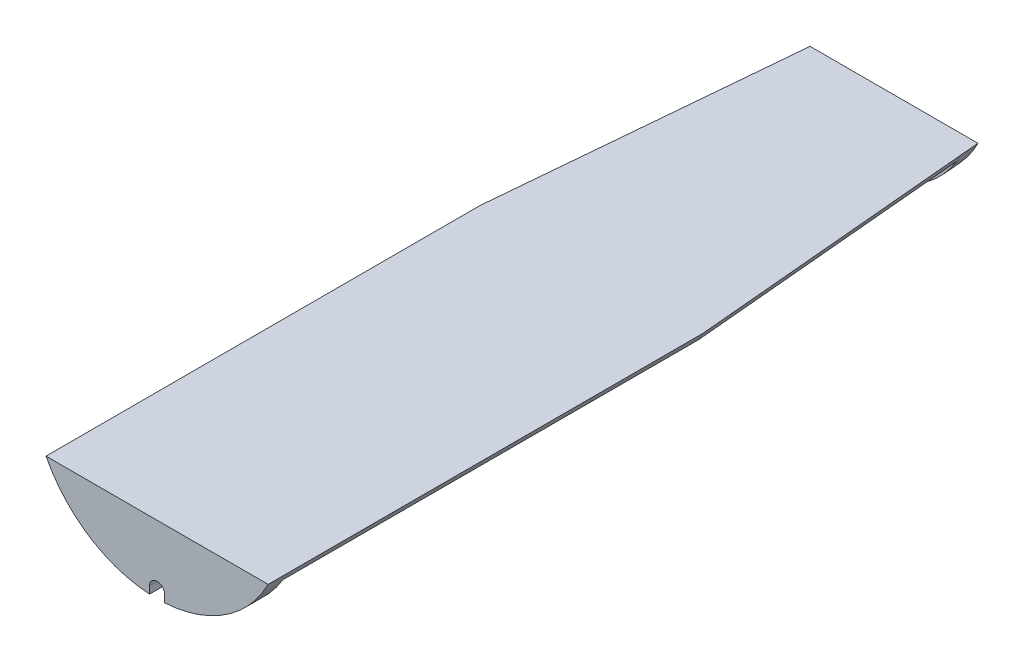
ISO-10303-21;
HEADER;
FILE_DESCRIPTION(('STEP AP214'),'2;1');
FILE_NAME('part.step','',(''),(''),'','','');
FILE_SCHEMA(('AUTOMOTIVE_DESIGN { 1 0 10303 214 1 1 1 1 }'));
ENDSEC;
DATA;
#1=APPLICATION_CONTEXT('core data for automotive mechanical design processes');
#2=APPLICATION_PROTOCOL_DEFINITION('international standard','automotive_design',2000,#1);
#3=PRODUCT_CONTEXT('',#1,'mechanical');
#4=PRODUCT('Part','Part','',(#3));
#5=PRODUCT_RELATED_PRODUCT_CATEGORY('part','',(#4));
#6=PRODUCT_DEFINITION_FORMATION('','',#4);
#7=PRODUCT_DEFINITION_CONTEXT('part definition',#1,'design');
#8=PRODUCT_DEFINITION('design','',#6,#7);
#9=PRODUCT_DEFINITION_SHAPE('','',#8);
#10=(LENGTH_UNIT() NAMED_UNIT(*) SI_UNIT(.MILLI.,.METRE.));
#11=(NAMED_UNIT(*) PLANE_ANGLE_UNIT() SI_UNIT($,.RADIAN.));
#12=(NAMED_UNIT(*) SI_UNIT($,.STERADIAN.) SOLID_ANGLE_UNIT());
#13=UNCERTAINTY_MEASURE_WITH_UNIT(LENGTH_MEASURE(1.E-05),#10,'distance_accuracy_value','');
#14=(GEOMETRIC_REPRESENTATION_CONTEXT(3) GLOBAL_UNCERTAINTY_ASSIGNED_CONTEXT((#13)) GLOBAL_UNIT_ASSIGNED_CONTEXT((#10,
#11,#12)) REPRESENTATION_CONTEXT('',''));
#15=CARTESIAN_POINT('',(0.,0.,0.));
#16=DIRECTION('',(0.,0.,1.));
#17=DIRECTION('',(1.,0.,0.));
#18=AXIS2_PLACEMENT_3D('',#15,#16,#17);
#19=CARTESIAN_POINT('',(0.,15.,-5.));
#20=DIRECTION('',(0.,0.,1.));
#21=DIRECTION('',(1.,0.,0.));
#22=AXIS2_PLACEMENT_3D('',#19,#20,#21);
#23=PLANE('',#22);
#24=DIRECTION('',(-1.,0.,0.));
#25=VECTOR('',#24,1.);
#26=CARTESIAN_POINT('',(28.2842712474619,-2.00000000000001,-5.));
#27=LINE('',#26,#25);
#28=CARTESIAN_POINT('',(28.2842712474619,-2.00000000000001,-5.));
#29=VERTEX_POINT('',#28);
#30=CARTESIAN_POINT('',(-28.2842712474619,-2.00000000000001,-5.));
#31=VERTEX_POINT('',#30);
#32=EDGE_CURVE('E178',#29,#31,#27,.T.);
#33=ORIENTED_EDGE('',*,*,#32,.F.);
#34=CARTESIAN_POINT('',(0.,15.,-5.));
#35=DIRECTION('',(0.,0.,1.));
#36=DIRECTION('',(1.,0.,0.));
#37=AXIS2_PLACEMENT_3D('',#34,#35,#36);
#38=CIRCLE('',#37,33.);
#39=CARTESIAN_POINT('',(2.00000000000002,-17.9393381840012,-5.));
#40=VERTEX_POINT('',#39);
#41=EDGE_CURVE('E259',#40,#29,#38,.T.);
#42=ORIENTED_EDGE('',*,*,#41,.F.);
#43=DIRECTION('',(0.,-1.,0.));
#44=VECTOR('',#43,1.);
#45=CARTESIAN_POINT('',(2.00000000000002,-16.,-5.));
#46=LINE('',#45,#44);
#47=CARTESIAN_POINT('',(2.00000000000002,-16.,-5.));
#48=VERTEX_POINT('',#47);
#49=EDGE_CURVE('E247',#48,#40,#46,.T.);
#50=ORIENTED_EDGE('',*,*,#49,.F.);
#51=CARTESIAN_POINT('',(0.,-16.,-5.));
#52=DIRECTION('',(0.,0.,-1.));
#53=DIRECTION('',(1.,0.,0.));
#54=AXIS2_PLACEMENT_3D('',#51,#52,#53);
#55=CIRCLE('',#54,2.);
#56=CARTESIAN_POINT('',(-1.99999999999998,-16.,-5.));
#57=VERTEX_POINT('',#56);
#58=EDGE_CURVE('E253',#57,#48,#55,.T.);
#59=ORIENTED_EDGE('',*,*,#58,.F.);
#60=DIRECTION('',(0.,1.,0.));
#61=VECTOR('',#60,1.);
#62=CARTESIAN_POINT('',(-1.99999999999998,-17.9393381840012,-5.));
#63=LINE('',#62,#61);
#64=CARTESIAN_POINT('',(-1.99999999999998,-17.9393381840012,-5.));
#65=VERTEX_POINT('',#64);
#66=EDGE_CURVE('E257',#65,#57,#63,.T.);
#67=ORIENTED_EDGE('',*,*,#66,.F.);
#68=CARTESIAN_POINT('',(0.,15.,-5.));
#69=DIRECTION('',(0.,0.,1.));
#70=DIRECTION('',(1.,0.,0.));
#71=AXIS2_PLACEMENT_3D('',#68,#69,#70);
#72=CIRCLE('',#71,33.);
#73=EDGE_CURVE('E239',#31,#65,#72,.T.);
#74=ORIENTED_EDGE('',*,*,#73,.F.);
#75=EDGE_LOOP('',(#33,#42,#50,#59,#67,#74));
#76=FACE_BOUND('',#75,.T.);
#77=ADVANCED_FACE('F157',(#76),#23,.F.);
#78=CARTESIAN_POINT('',(0.,15.,-5.));
#79=DIRECTION('',(0.,0.,1.));
#80=DIRECTION('',(1.,0.,0.));
#81=AXIS2_PLACEMENT_3D('',#78,#79,#80);
#82=CYLINDRICAL_SURFACE('',#81,33.);
#83=CARTESIAN_POINT('',(0.,15.,0.));
#84=DIRECTION('',(0.,0.,1.));
#85=DIRECTION('',(1.,0.,0.));
#86=AXIS2_PLACEMENT_3D('',#83,#84,#85);
#87=CIRCLE('',#86,33.);
#88=CARTESIAN_POINT('',(2.00000000000002,-17.9393381840012,0.));
#89=VERTEX_POINT('',#88);
#90=CARTESIAN_POINT('',(29.3938769133981,0.,0.));
#91=VERTEX_POINT('',#90);
#92=EDGE_CURVE('E264',#89,#91,#87,.T.);
#93=ORIENTED_EDGE('',*,*,#92,.F.);
#94=DIRECTION('',(0.,0.,1.));
#95=VECTOR('',#94,1.);
#96=CARTESIAN_POINT('',(2.00000000000002,-17.9393381840012,-5.));
#97=LINE('',#96,#95);
#98=EDGE_CURVE('E12',#40,#89,#97,.T.);
#99=ORIENTED_EDGE('',*,*,#98,.F.);
#100=ORIENTED_EDGE('',*,*,#41,.T.);
#101=DIRECTION('',(0.,0.,1.));
#102=VECTOR('',#101,1.);
#103=CARTESIAN_POINT('',(28.2842712474619,-2.00000000000001,-115.));
#104=LINE('',#103,#102);
#105=CARTESIAN_POINT('',(28.2842712474619,-2.,-115.));
#106=VERTEX_POINT('',#105);
#107=EDGE_CURVE('E268',#106,#29,#104,.T.);
#108=ORIENTED_EDGE('',*,*,#107,.F.);
#109=CARTESIAN_POINT('',(29.3938769133981,0.,-115.));
#110=CARTESIAN_POINT('',(29.3071144612497,-0.170019355881885,-114.999994009761));
#111=CARTESIAN_POINT('',(29.2188765786215,-0.339285789890905,-114.999975122605));
#112=CARTESIAN_POINT('',(29.0394771916427,-0.676262181711073,-114.999940279216));
#113=CARTESIAN_POINT('',(28.9483156872977,-0.843972139525185,-114.999924322983));
#114=CARTESIAN_POINT('',(28.7633315166437,-1.1773610188988,-114.999924066524));
#115=CARTESIAN_POINT('',(28.6695161975613,-1.34304401719383,-114.999939685997));
#116=CARTESIAN_POINT('',(28.4790286187982,-1.67276773070671,-114.999974321316));
#117=CARTESIAN_POINT('',(28.3823562523676,-1.83680838425315,-114.99999333729));
#118=CARTESIAN_POINT('',(28.2842712474619,-1.99999999999998,-115.));
#119=B_SPLINE_CURVE_WITH_KNOTS('',3,(#109,#110,#111,#112,#113,#114,#115,#116,#117,#118),
.UNSPECIFIED.,.F.,.F.,(4,2,2,2,4),(0.,0.572625992789031,1.14525198448761,1.71642355424388,
2.28761649212509),.UNSPECIFIED.);
#120=CARTESIAN_POINT('',(29.3938769133982,0.,-114.999999999998));
#121=VERTEX_POINT('',#120);
#122=EDGE_CURVE('E288',#121,#106,#119,.T.);
#123=ORIENTED_EDGE('',*,*,#122,.F.);
#124=DIRECTION('',(0.,0.,1.));
#125=VECTOR('',#124,1.);
#126=CARTESIAN_POINT('',(29.3938769133981,0.,-5.));
#127=LINE('',#126,#125);
#128=EDGE_CURVE('E215',#121,#91,#127,.T.);
#129=ORIENTED_EDGE('',*,*,#128,.T.);
#130=EDGE_LOOP('',(#93,#99,#100,#108,#123,#129));
#131=FACE_BOUND('',#130,.T.);
#132=ADVANCED_FACE('F159',(#131),#82,.T.);
#133=CARTESIAN_POINT('',(2.00000000000002,-16.,-5.));
#134=DIRECTION('',(-1.,0.,0.));
#135=DIRECTION('',(0.,0.,1.));
#136=AXIS2_PLACEMENT_3D('',#133,#134,#135);
#137=PLANE('',#136);
#138=DIRECTION('',(0.,-1.,0.));
#139=VECTOR('',#138,1.);
#140=CARTESIAN_POINT('',(2.00000000000002,-16.,0.));
#141=LINE('',#140,#139);
#142=CARTESIAN_POINT('',(2.00000000000002,-16.,0.));
#143=VERTEX_POINT('',#142);
#144=EDGE_CURVE('E249',#143,#89,#141,.T.);
#145=ORIENTED_EDGE('',*,*,#144,.F.);
#146=DIRECTION('',(0.,0.,1.));
#147=VECTOR('',#146,1.);
#148=CARTESIAN_POINT('',(2.00000000000002,-16.,-5.));
#149=LINE('',#148,#147);
#150=EDGE_CURVE('E169',#48,#143,#149,.T.);
#151=ORIENTED_EDGE('',*,*,#150,.F.);
#152=ORIENTED_EDGE('',*,*,#49,.T.);
#153=ORIENTED_EDGE('',*,*,#98,.T.);
#154=EDGE_LOOP('',(#145,#151,#152,#153));
#155=FACE_BOUND('',#154,.T.);
#156=ADVANCED_FACE('F245',(#155),#137,.T.);
#157=CARTESIAN_POINT('',(0.,-16.,-5.));
#158=DIRECTION('',(0.,0.,1.));
#159=DIRECTION('',(1.,0.,0.));
#160=AXIS2_PLACEMENT_3D('',#157,#158,#159);
#161=CYLINDRICAL_SURFACE('',#160,2.);
#162=CARTESIAN_POINT('',(0.,-16.,0.));
#163=DIRECTION('',(0.,0.,-1.));
#164=DIRECTION('',(1.,0.,0.));
#165=AXIS2_PLACEMENT_3D('',#162,#163,#164);
#166=CIRCLE('',#165,2.);
#167=CARTESIAN_POINT('',(-1.99999999999998,-16.,0.));
#168=VERTEX_POINT('',#167);
#169=EDGE_CURVE('E277',#168,#143,#166,.T.);
#170=ORIENTED_EDGE('',*,*,#169,.F.);
#171=DIRECTION('',(0.,0.,1.));
#172=VECTOR('',#171,1.);
#173=CARTESIAN_POINT('',(-1.99999999999998,-16.,-5.));
#174=LINE('',#173,#172);
#175=EDGE_CURVE('E250',#57,#168,#174,.T.);
#176=ORIENTED_EDGE('',*,*,#175,.F.);
#177=ORIENTED_EDGE('',*,*,#58,.T.);
#178=ORIENTED_EDGE('',*,*,#150,.T.);
#179=EDGE_LOOP('',(#170,#176,#177,#178));
#180=FACE_BOUND('',#179,.T.);
#181=ADVANCED_FACE('F254',(#180),#161,.F.);
#182=CARTESIAN_POINT('',(-1.99999999999998,-17.9393381840012,-5.));
#183=DIRECTION('',(1.,0.,0.));
#184=DIRECTION('',(0.,0.,-1.));
#185=AXIS2_PLACEMENT_3D('',#182,#183,#184);
#186=PLANE('',#185);
#187=DIRECTION('',(0.,1.,0.));
#188=VECTOR('',#187,1.);
#189=CARTESIAN_POINT('',(-1.99999999999998,-17.9393381840012,0.));
#190=LINE('',#189,#188);
#191=CARTESIAN_POINT('',(-1.99999999999998,-17.9393381840012,0.));
#192=VERTEX_POINT('',#191);
#193=EDGE_CURVE('E274',#192,#168,#190,.T.);
#194=ORIENTED_EDGE('',*,*,#193,.F.);
#195=DIRECTION('',(0.,0.,1.));
#196=VECTOR('',#195,1.);
#197=CARTESIAN_POINT('',(-1.99999999999998,-17.9393381840012,-5.));
#198=LINE('',#197,#196);
#199=EDGE_CURVE('E281',#65,#192,#198,.T.);
#200=ORIENTED_EDGE('',*,*,#199,.F.);
#201=ORIENTED_EDGE('',*,*,#66,.T.);
#202=ORIENTED_EDGE('',*,*,#175,.T.);
#203=EDGE_LOOP('',(#194,#200,#201,#202));
#204=FACE_BOUND('',#203,.T.);
#205=ADVANCED_FACE('F656',(#204),#186,.T.);
#206=CARTESIAN_POINT('',(0.,15.,-5.));
#207=DIRECTION('',(0.,0.,1.));
#208=DIRECTION('',(1.,0.,0.));
#209=AXIS2_PLACEMENT_3D('',#206,#207,#208);
#210=CYLINDRICAL_SURFACE('',#209,33.);
#211=CARTESIAN_POINT('',(0.,15.,0.));
#212=DIRECTION('',(0.,0.,1.));
#213=DIRECTION('',(1.,0.,0.));
#214=AXIS2_PLACEMENT_3D('',#211,#212,#213);
#215=CIRCLE('',#214,33.);
#216=CARTESIAN_POINT('',(-29.3938769133981,0.,0.));
#217=VERTEX_POINT('',#216);
#218=EDGE_CURVE('E271',#217,#192,#215,.T.);
#219=ORIENTED_EDGE('',*,*,#218,.F.);
#220=DIRECTION('',(0.,0.,1.));
#221=VECTOR('',#220,1.);
#222=CARTESIAN_POINT('',(-29.3938769133981,0.,-5.));
#223=LINE('',#222,#221);
#224=CARTESIAN_POINT('',(-29.3938769133982,0.,-114.999999999998));
#225=VERTEX_POINT('',#224);
#226=EDGE_CURVE('E207',#225,#217,#223,.T.);
#227=ORIENTED_EDGE('',*,*,#226,.F.);
#228=CARTESIAN_POINT('',(-28.2842712474619,-2.00000000000002,-115.));
#229=CARTESIAN_POINT('',(-28.3828865129268,-1.83592615748093,-114.99999317055));
#230=CARTESIAN_POINT('',(-28.4800738393566,-1.67099403518538,-114.999974030781));
#231=CARTESIAN_POINT('',(-28.6715638082345,-1.33946361384528,-114.999939356516));
#232=CARTESIAN_POINT('',(-28.7658664506882,-1.17286531480394,-114.999923822018));
#233=CARTESIAN_POINT('',(-28.9507880335584,-0.839441657158417,-114.999924581042));
#234=CARTESIAN_POINT('',(-29.0414310428727,-0.672629646944314,-114.999940611599));
#235=CARTESIAN_POINT('',(-29.2198282560075,-0.337460080576456,-114.999975402894));
#236=CARTESIAN_POINT('',(-29.3075823528828,-0.169102467500099,-114.999994163733));
#237=CARTESIAN_POINT('',(-29.3938769133981,0.,-115.));
#238=B_SPLINE_CURVE_WITH_KNOTS('',3,(#228,#229,#230,#231,#232,#233,#234,#235,#236,#237),
.UNSPECIFIED.,.F.,.F.,(4,2,2,2,4),(0.,0.574280861115278,1.14856172112653,1.71807857624825,
2.2876164907787),.UNSPECIFIED.);
#239=CARTESIAN_POINT('',(-28.2842712474619,-2.00000000000002,-115.));
#240=VERTEX_POINT('',#239);
#241=EDGE_CURVE('E285',#240,#225,#238,.T.);
#242=ORIENTED_EDGE('',*,*,#241,.F.);
#243=DIRECTION('',(0.,0.,1.));
#244=VECTOR('',#243,1.);
#245=CARTESIAN_POINT('',(-28.2842712474619,-2.00000000000001,-115.));
#246=LINE('',#245,#244);
#247=EDGE_CURVE('E200',#240,#31,#246,.T.);
#248=ORIENTED_EDGE('',*,*,#247,.T.);
#249=ORIENTED_EDGE('',*,*,#73,.T.);
#250=ORIENTED_EDGE('',*,*,#199,.T.);
#251=EDGE_LOOP('',(#219,#227,#242,#248,#249,#250));
#252=FACE_BOUND('',#251,.T.);
#253=ADVANCED_FACE('F628',(#252),#210,.T.);
#254=CARTESIAN_POINT('',(29.3938769133981,0.,-5.));
#255=DIRECTION('',(0.,1.,0.));
#256=DIRECTION('',(0.,0.,1.));
#257=AXIS2_PLACEMENT_3D('',#254,#255,#256);
#258=PLANE('',#257);
#259=DIRECTION('',(-1.,0.,0.));
#260=VECTOR('',#259,1.);
#261=CARTESIAN_POINT('',(29.3938769133981,0.,0.));
#262=LINE('',#261,#260);
#263=EDGE_CURVE('E267',#91,#217,#262,.T.);
#264=ORIENTED_EDGE('',*,*,#263,.F.);
#265=ORIENTED_EDGE('',*,*,#128,.F.);
#266=DIRECTION('',(0.0895151366027043,0.,0.995985461901427));
#267=VECTOR('',#266,1.);
#268=CARTESIAN_POINT('',(26.0235289002927,0.,-152.5));
#269=LINE('',#268,#267);
#270=CARTESIAN_POINT('',(22.6531808871872,0.,-190.));
#271=VERTEX_POINT('',#270);
#272=EDGE_CURVE('E636',#271,#121,#269,.T.);
#273=ORIENTED_EDGE('',*,*,#272,.F.);
#274=DIRECTION('',(0.0833574323912778,0.,0.996519713033884));
#275=VECTOR('',#274,1.);
#276=CARTESIAN_POINT('',(22.444059503784,0.,-192.5));
#277=LINE('',#276,#275);
#278=CARTESIAN_POINT('',(22.2349381203808,0.,-195.));
#279=VERTEX_POINT('',#278);
#280=EDGE_CURVE('E415',#279,#271,#277,.T.);
#281=ORIENTED_EDGE('',*,*,#280,.F.);
#282=DIRECTION('',(1.,0.,0.));
#283=VECTOR('',#282,1.);
#284=CARTESIAN_POINT('',(-22.2349381203808,0.,-195.));
#285=LINE('',#284,#283);
#286=CARTESIAN_POINT('',(-22.2349381203808,0.,-195.));
#287=VERTEX_POINT('',#286);
#288=EDGE_CURVE('E546',#287,#279,#285,.T.);
#289=ORIENTED_EDGE('',*,*,#288,.F.);
#290=DIRECTION('',(0.0833574323912771,0.,-0.996519713033884));
#291=VECTOR('',#290,1.);
#292=CARTESIAN_POINT('',(-22.444059503784,0.,-192.5));
#293=LINE('',#292,#291);
#294=CARTESIAN_POINT('',(-22.6531808871872,0.,-190.));
#295=VERTEX_POINT('',#294);
#296=EDGE_CURVE('E580',#295,#287,#293,.T.);
#297=ORIENTED_EDGE('',*,*,#296,.F.);
#298=DIRECTION('',(0.0895151366027044,0.,-0.995985461901427));
#299=VECTOR('',#298,1.);
#300=CARTESIAN_POINT('',(-26.0235289002927,0.,-152.5));
#301=LINE('',#300,#299);
#302=EDGE_CURVE('E367',#225,#295,#301,.T.);
#303=ORIENTED_EDGE('',*,*,#302,.F.);
#304=ORIENTED_EDGE('',*,*,#226,.T.);
#305=EDGE_LOOP('',(#264,#265,#273,#281,#289,#297,#303,#304));
#306=FACE_BOUND('',#305,.T.);
#307=ADVANCED_FACE('F649',(#306),#258,.T.);
#308=CARTESIAN_POINT('',(0.,15.,0.));
#309=DIRECTION('',(0.,0.,1.));
#310=DIRECTION('',(1.,0.,0.));
#311=AXIS2_PLACEMENT_3D('',#308,#309,#310);
#312=PLANE('',#311);
#313=ORIENTED_EDGE('',*,*,#92,.T.);
#314=ORIENTED_EDGE('',*,*,#263,.T.);
#315=ORIENTED_EDGE('',*,*,#218,.T.);
#316=ORIENTED_EDGE('',*,*,#193,.T.);
#317=ORIENTED_EDGE('',*,*,#169,.T.);
#318=ORIENTED_EDGE('',*,*,#144,.T.);
#319=EDGE_LOOP('',(#313,#314,#315,#316,#317,#318));
#320=FACE_BOUND('',#319,.T.);
#321=ADVANCED_FACE('F652',(#320),#312,.T.);
#322=CARTESIAN_POINT('',(28.2842712474619,-2.00000000000001,-115.));
#323=DIRECTION('',(0.,1.,0.));
#324=DIRECTION('',(0.,0.,1.));
#325=AXIS2_PLACEMENT_3D('',#322,#323,#324);
#326=PLANE('',#325);
#327=ORIENTED_EDGE('',*,*,#32,.T.);
#328=ORIENTED_EDGE('',*,*,#247,.F.);
#329=DIRECTION('',(0.0894262907466011,6.13267340762444E-13,-0.995993443012204));
#330=VECTOR('',#329,1.);
#331=CARTESIAN_POINT('',(-28.2842712474619,-2.00000000000002,-115.));
#332=LINE('',#331,#330);
#333=CARTESIAN_POINT('',(-21.5503946445064,-2.00005273718804,-190.));
#334=VERTEX_POINT('',#333);
#335=EDGE_CURVE('E630',#240,#334,#332,.T.);
#336=ORIENTED_EDGE('',*,*,#335,.T.);
#337=DIRECTION('',(1.,0.,0.));
#338=VECTOR('',#337,1.);
#339=CARTESIAN_POINT('',(-21.5503194799572,-1.99999999995384,-190.));
#340=LINE('',#339,#338);
#341=CARTESIAN_POINT('',(21.5498162340958,-1.99999999995408,-190.));
#342=VERTEX_POINT('',#341);
#343=EDGE_CURVE('E366',#334,#342,#340,.T.);
#344=ORIENTED_EDGE('',*,*,#343,.T.);
#345=DIRECTION('',(-0.0894329203568512,6.09569541780894E-13,-0.99599284774362));
#346=VECTOR('',#345,1.);
#347=CARTESIAN_POINT('',(24.9170437407788,-1.99999999997703,-152.5));
#348=LINE('',#347,#346);
#349=EDGE_CURVE('E632',#106,#342,#348,.T.);
#350=ORIENTED_EDGE('',*,*,#349,.F.);
#351=ORIENTED_EDGE('',*,*,#107,.T.);
#352=EDGE_LOOP('',(#327,#328,#336,#344,#350,#351));
#353=FACE_BOUND('',#352,.T.);
#354=ADVANCED_FACE('F310',(#353),#326,.F.);
#355=CARTESIAN_POINT('',(29.4612838736603,0.,-114.25));
#356=CARTESIAN_POINT('',(29.3938769133981,0.,-115.));
#357=CARTESIAN_POINT('',(22.6531808871872,0.,-190.));
#358=CARTESIAN_POINT('',(29.1147059233197,-0.6790542636661,-114.25));
#359=CARTESIAN_POINT('',(29.0473334165954,-0.679083792677174,-115.));
#360=CARTESIAN_POINT('',(22.3100827441694,-0.682036693784612,-190.));
#361=CARTESIAN_POINT('',(28.7443676855565,-1.34652972163904,-114.25));
#362=CARTESIAN_POINT('',(28.6770205438383,-1.34655131582584,-115.));
#363=CARTESIAN_POINT('',(21.9423063720174,-1.34871073450649,-190.));
#364=CARTESIAN_POINT('',(28.3516157975956,-2.00000000000044,-114.25));
#365=CARTESIAN_POINT('',(28.2842712474619,-1.99999999999998,-115.));
#366=CARTESIAN_POINT('',(21.5498162340958,-1.99999999995408,-190.));
#367=B_SPLINE_SURFACE_WITH_KNOTS('',3,1,((#355,#356,#357),(#358,#359,#360),(#361,#362,#363),
(#364,#365,#366)),.UNSPECIFIED.,.F.,.F.,.F.,(4,4),(2,1,2),(0.,1.),(-0.01,0.,1.),.UNSPECIFIED.);
#368=CARTESIAN_POINT('',(1.99999990450064,-15.3053872047928,-190.));
#369=CARTESIAN_POINT('',(3.1003627036189,-15.1824151203169,-190.));
#370=CARTESIAN_POINT('',(4.19029742491108,-14.9649792913923,-190.));
#371=CARTESIAN_POINT('',(5.81197848553569,-14.5190616567516,-190.));
#372=CARTESIAN_POINT('',(6.34835271227585,-14.3506762600069,-190.));
#373=CARTESIAN_POINT('',(7.40069893302721,-13.9810905508963,-190.));
#374=CARTESIAN_POINT('',(7.91865594693141,-13.7794454736696,-190.));
#375=CARTESIAN_POINT('',(9.44935373508057,-13.1269790536173,-190.));
#376=CARTESIAN_POINT('',(10.4388848513126,-12.6285518524233,-190.));
#377=CARTESIAN_POINT('',(11.8788615137415,-11.7900052643811,-190.));
#378=CARTESIAN_POINT('',(12.3514378746939,-11.4952788959146,-190.));
#379=CARTESIAN_POINT('',(13.2817688029954,-10.8754248404166,-190.));
#380=CARTESIAN_POINT('',(13.7403145158537,-10.549553496199,-190.));
#381=CARTESIAN_POINT('',(15.9681704173798,-8.86426300019228,-190.));
#382=CARTESIAN_POINT('',(17.5671229786123,-7.32705894995121,-190.));
#383=CARTESIAN_POINT('',(19.3462585542599,-5.17924501061187,-190.));
#384=CARTESIAN_POINT('',(19.6916459626129,-4.7372433855864,-190.));
#385=CARTESIAN_POINT('',(20.3563117962785,-3.83483942716996,-190.));
#386=CARTESIAN_POINT('',(21.312728642142,-2.45597050498727,-190.));
#387=CARTESIAN_POINT('',(22.1489771975152,-1.00229460431685,-190.));
#388=CARTESIAN_POINT('',(22.6531808871872,0.,-190.));
#389=B_SPLINE_CURVE_WITH_KNOTS('',3,(#368,#369,#370,#371,#372,#373,#374,#375,#376,#377,#378,
#379,#380,#381,#382,#383,#384,#385,#386,#387,#388),.UNSPECIFIED.,.F.,.F.,(4,2,2,2,2,2,2,2,2,1,
4),(0.,0.125,0.187500000000001,0.250000000000001,0.375000000000001,0.437500000000001,
0.500000000000001,0.75,0.8125,0.875,1.),.UNSPECIFIED.);
#390=EDGE_CURVE('E371',#342,#271,#389,.T.);
#391=ORIENTED_EDGE('',*,*,#122,.T.);
#392=ORIENTED_EDGE('',*,*,#349,.T.);
#393=ORIENTED_EDGE('',*,*,#390,.T.);
#394=ORIENTED_EDGE('',*,*,#272,.T.);
#395=EDGE_LOOP('',(#391,#392,#393,#394));
#396=FACE_BOUND('',#395,.T.);
#397=ADVANCED_FACE('F303',(#396),#367,.T.);
#398=CARTESIAN_POINT('',(-28.3516107651369,-2.00000000000048,-114.25));
#399=CARTESIAN_POINT('',(-28.2842712474619,-2.00000000000002,-115.));
#400=CARTESIAN_POINT('',(-21.5503194799575,-1.99999999995379,-190.));
#401=CARTESIAN_POINT('',(-28.7443764629986,-1.34651039711251,-114.25));
#402=CARTESIAN_POINT('',(-28.6770205438383,-1.34655131582587,-115.));
#403=CARTESIAN_POINT('',(-21.9414286278058,-1.3506431871617,-190.));
#404=CARTESIAN_POINT('',(-29.1147158379685,-0.679034554537922,-114.25));
#405=CARTESIAN_POINT('',(-29.0473334165954,-0.679083792677183,-115.));
#406=CARTESIAN_POINT('',(-22.3090912792864,-0.68400760660326,-190.));
#407=CARTESIAN_POINT('',(-29.4612838736603,0.,-114.25));
#408=CARTESIAN_POINT('',(-29.3938769133981,0.,-115.));
#409=CARTESIAN_POINT('',(-22.6531808871872,0.,-190.));
#410=B_SPLINE_SURFACE_WITH_KNOTS('',3,1,((#398,#399,#400),(#401,#402,#403),(#404,#405,#406),
(#407,#408,#409)),.UNSPECIFIED.,.F.,.F.,.F.,(4,4),(2,1,2),(0.,1.),(-0.01,0.,1.),.UNSPECIFIED.);
#411=CARTESIAN_POINT('',(-22.6531808871872,0.,-190.));
#412=CARTESIAN_POINT('',(-21.6426790129121,-2.00875281502326,-190.));
#413=CARTESIAN_POINT('',(-20.4288727315374,-3.86768155479657,-190.));
#414=CARTESIAN_POINT('',(-18.3080144340473,-6.43488158586132,-190.));
#415=CARTESIAN_POINT('',(-17.5503646459693,-7.25325403519129,-190.));
#416=CARTESIAN_POINT('',(-15.928293308856,-8.81131406628508,-190.));
#417=CARTESIAN_POINT('',(-15.0800375542837,-9.53547961107537,-190.));
#418=CARTESIAN_POINT('',(-13.3117763588939,-10.8743436194902,-190.));
#419=CARTESIAN_POINT('',(-12.3916191692708,-11.4894433869494,-190.));
#420=CARTESIAN_POINT('',(-10.4773198085824,-12.6080650758275,-190.));
#421=CARTESIAN_POINT('',(-9.48316466029619,-13.1115674261073,-190.));
#422=CARTESIAN_POINT('',(-7.41343378107669,-13.9957805403472,-190.));
#423=CARTESIAN_POINT('',(-6.358212923246,-14.3681933014407,-190.));
#424=CARTESIAN_POINT('',(-4.21079810150041,-14.9600036778373,-190.));
#425=CARTESIAN_POINT('',(-3.11768943033474,-15.1804789226603,-190.));
#426=CARTESIAN_POINT('',(-2.00000009549937,-15.3053872795212,-190.));
#427=B_SPLINE_CURVE_WITH_KNOTS('',3,(#411,#412,#413,#414,#415,#416,#417,#418,#419,#420,#421,
#422,#423,#424,#425,#426),.UNSPECIFIED.,.F.,.F.,(4,2,2,2,2,2,2,4),(0.,0.25,0.375,0.5,0.625,0.75,
0.875,1.),.UNSPECIFIED.);
#428=EDGE_CURVE('E343',#295,#334,#427,.T.);
#429=ORIENTED_EDGE('',*,*,#241,.T.);
#430=ORIENTED_EDGE('',*,*,#302,.T.);
#431=ORIENTED_EDGE('',*,*,#428,.T.);
#432=ORIENTED_EDGE('',*,*,#335,.F.);
#433=EDGE_LOOP('',(#429,#430,#431,#432));
#434=FACE_BOUND('',#433,.T.);
#435=ADVANCED_FACE('F309',(#434),#410,.T.);
#436=CARTESIAN_POINT('',(-13.954167527344,-10.0564418690135,-195.));
#437=DIRECTION('',(0.,0.,1.));
#438=DIRECTION('',(1.,0.,0.));
#439=AXIS2_PLACEMENT_3D('',#436,#437,#438);
#440=PLANE('',#439);
#441=CARTESIAN_POINT('',(-1.99999989983672,-15.1395173348003,-195.));
#442=CARTESIAN_POINT('',(-3.09747576160438,-15.0120010279453,-195.));
#443=CARTESIAN_POINT('',(-4.17049291319312,-14.7891320218174,-195.));
#444=CARTESIAN_POINT('',(-5.75132361698356,-14.3429604731734,-195.));
#445=CARTESIAN_POINT('',(-6.27341787272374,-14.1753314972496,-195.));
#446=CARTESIAN_POINT('',(-7.30835386155627,-13.8040024278692,-195.));
#447=CARTESIAN_POINT('',(-7.82270179831675,-13.5997317028177,-195.));
#448=CARTESIAN_POINT('',(-9.34161874542326,-12.9390214817723,-195.));
#449=CARTESIAN_POINT('',(-10.3144730725214,-12.4385197783543,-195.));
#450=CARTESIAN_POINT('',(-12.1879834420699,-11.3285056847159,-195.));
#451=CARTESIAN_POINT('',(-13.088646638719,-10.7190040964714,-195.));
#452=CARTESIAN_POINT('',(-14.819688415969,-9.39387964155557,-195.));
#453=CARTESIAN_POINT('',(-15.6512261463837,-8.67687280078676,-195.));
#454=CARTESIAN_POINT('',(-17.2374737995902,-7.13980979185258,-195.));
#455=CARTESIAN_POINT('',(-17.9786802449163,-6.33307563235249,-195.));
#456=CARTESIAN_POINT('',(-20.0543378247452,-3.80399763299167,-195.));
#457=CARTESIAN_POINT('',(-21.2434211714143,-1.97468700638408,-195.));
#458=CARTESIAN_POINT('',(-22.2349381203808,0.,-195.));
#459=B_SPLINE_CURVE_WITH_KNOTS('',3,(#441,#442,#443,#444,#445,#446,#447,#448,#449,#450,#451,
#452,#453,#454,#455,#456,#457,#458),.UNSPECIFIED.,.F.,.F.,(4,2,2,2,2,2,2,2,4),(0.,0.125,0.1875,
0.25,0.375,0.5,0.625,0.75,1.),.UNSPECIFIED.);
#460=CARTESIAN_POINT('',(-1.99999989983677,-15.1395173348003,-195.));
#461=VERTEX_POINT('',#460);
#462=EDGE_CURVE('E554',#461,#287,#459,.T.);
#463=ORIENTED_EDGE('',*,*,#462,.T.);
#464=ORIENTED_EDGE('',*,*,#288,.T.);
#465=CARTESIAN_POINT('',(22.2349381203808,0.,-195.));
#466=CARTESIAN_POINT('',(21.7402827283196,-0.985146630392382,-195.));
#467=CARTESIAN_POINT('',(20.9207449497946,-2.41439869391795,-195.));
#468=CARTESIAN_POINT('',(19.9846908625917,-3.77083377273424,-195.));
#469=CARTESIAN_POINT('',(19.3344289518255,-4.65873395220668,-195.));
#470=CARTESIAN_POINT('',(18.9959859026243,-5.09458862674408,-195.));
#471=CARTESIAN_POINT('',(17.2532883292961,-7.21256588491938,-195.));
#472=CARTESIAN_POINT('',(15.6883773353755,-8.72995729693448,-195.));
#473=CARTESIAN_POINT('',(13.5099147931701,-10.396251463131,-195.));
#474=CARTESIAN_POINT('',(13.0614660446151,-10.7187553662885,-195.));
#475=CARTESIAN_POINT('',(12.1499630971055,-11.3336796842863,-195.));
#476=CARTESIAN_POINT('',(11.6869641756435,-11.6262559768215,-195.));
#477=CARTESIAN_POINT('',(10.2762012652448,-12.4592783651829,-195.));
#478=CARTESIAN_POINT('',(9.30679244536886,-12.9552671463784,-195.));
#479=CARTESIAN_POINT('',(7.80722834625949,-13.6058966855108,-195.));
#480=CARTESIAN_POINT('',(7.29980804561071,-13.8072338625096,-195.));
#481=CARTESIAN_POINT('',(6.26885005592084,-14.1768039705652,-195.));
#482=CARTESIAN_POINT('',(5.74399474412948,-14.3453173244617,-195.));
#483=CARTESIAN_POINT('',(4.15137721340973,-14.7939423291808,-195.));
#484=CARTESIAN_POINT('',(3.08089942347835,-15.0139272192728,-195.));
#485=CARTESIAN_POINT('',(2.00000010016315,-15.1395174154236,-195.));
#486=B_SPLINE_CURVE_WITH_KNOTS('',3,(#465,#466,#467,#468,#469,#470,#471,#472,#473,#474,#475,
#476,#477,#478,#479,#480,#481,#482,#483,#484,#485),.UNSPECIFIED.,.F.,.F.,(4,1,2,2,2,2,2,2,2,2,
4),(0.,0.125,0.1875,0.25,0.5,0.5625,0.625,0.75,0.8125,0.875,1.),.UNSPECIFIED.);
#487=CARTESIAN_POINT('',(2.00000010016315,-15.1395174154236,-195.));
#488=VERTEX_POINT('',#487);
#489=EDGE_CURVE('E523',#279,#488,#486,.T.);
#490=ORIENTED_EDGE('',*,*,#489,.T.);
#491=DIRECTION('',(0.,1.,0.));
#492=VECTOR('',#491,1.);
#493=CARTESIAN_POINT('',(2.00000010016317,-15.1395174154236,-195.));
#494=LINE('',#493,#492);
#495=CARTESIAN_POINT('',(2.00000010016323,-13.2559839034802,-195.));
#496=VERTEX_POINT('',#495);
#497=EDGE_CURVE('E508',#488,#496,#494,.T.);
#498=ORIENTED_EDGE('',*,*,#497,.T.);
#499=CARTESIAN_POINT('',(1.00163233176381E-07,-13.2559839034815,-195.));
#500=DIRECTION('',(0.,0.,1.));
#501=DIRECTION('',(0.,1.,0.));
#502=AXIS2_PLACEMENT_3D('',#499,#500,#501);
#503=ELLIPSE('',#502,2.00104031216398,2.);
#504=CARTESIAN_POINT('',(-1.99999989983677,-13.2559839034815,-195.));
#505=VERTEX_POINT('',#504);
#506=EDGE_CURVE('E505',#496,#505,#503,.T.);
#507=ORIENTED_EDGE('',*,*,#506,.T.);
#508=DIRECTION('',(0.,-1.,0.));
#509=VECTOR('',#508,1.);
#510=CARTESIAN_POINT('',(-1.99999989983677,-13.2559839034815,-195.));
#511=LINE('',#510,#509);
#512=EDGE_CURVE('E512',#505,#461,#511,.T.);
#513=ORIENTED_EDGE('',*,*,#512,.T.);
#514=EDGE_LOOP('',(#463,#464,#490,#498,#507,#513));
#515=FACE_BOUND('',#514,.T.);
#516=ADVANCED_FACE('F312',(#515),#440,.F.);
#517=CARTESIAN_POINT('',(-14.1959069565888,-10.2049116152828,-190.));
#518=DIRECTION('',(0.,0.,1.));
#519=DIRECTION('',(1.,0.,0.));
#520=AXIS2_PLACEMENT_3D('',#517,#518,#519);
#521=PLANE('',#520);
#522=CARTESIAN_POINT('',(22.6531808871872,0.,-190.));
#523=CARTESIAN_POINT('',(22.1489771975152,-1.00229460431685,-190.));
#524=CARTESIAN_POINT('',(21.312728642142,-2.45597050498727,-190.));
#525=CARTESIAN_POINT('',(20.3563117962785,-3.83483942716996,-190.));
#526=CARTESIAN_POINT('',(19.6916459626129,-4.7372433855864,-190.));
#527=CARTESIAN_POINT('',(19.3462585542599,-5.17924501061187,-190.));
#528=CARTESIAN_POINT('',(17.5671229786123,-7.32705894995121,-190.));
#529=CARTESIAN_POINT('',(15.9681704173798,-8.86426300019228,-190.));
#530=CARTESIAN_POINT('',(13.7403145158537,-10.549553496199,-190.));
#531=CARTESIAN_POINT('',(13.2817688029954,-10.8754248404166,-190.));
#532=CARTESIAN_POINT('',(12.3514378746939,-11.4952788959146,-190.));
#533=CARTESIAN_POINT('',(11.8788615137415,-11.7900052643811,-190.));
#534=CARTESIAN_POINT('',(10.4388848513126,-12.6285518524233,-190.));
#535=CARTESIAN_POINT('',(9.44935373508057,-13.1269790536173,-190.));
#536=CARTESIAN_POINT('',(7.91865594693141,-13.7794454736696,-190.));
#537=CARTESIAN_POINT('',(7.40069893302721,-13.9810905508963,-190.));
#538=CARTESIAN_POINT('',(6.34835271227585,-14.3506762600069,-190.));
#539=CARTESIAN_POINT('',(5.81197848553569,-14.5190616567516,-190.));
#540=CARTESIAN_POINT('',(4.19029742491108,-14.9649792913923,-190.));
#541=CARTESIAN_POINT('',(3.1003627036189,-15.1824151203169,-190.));
#542=CARTESIAN_POINT('',(1.99999990450064,-15.3053872047928,-190.));
#543=B_SPLINE_CURVE_WITH_KNOTS('',3,(#522,#523,#524,#525,#526,#527,#528,#529,#530,#531,#532,
#533,#534,#535,#536,#537,#538,#539,#540,#541,#542),.UNSPECIFIED.,.F.,.F.,(4,1,2,2,2,2,2,2,2,2,
4),(0.,0.125,0.1875,0.25,0.499999999999999,0.562499999999999,0.624999999999999,
0.749999999999999,0.812499999999999,0.875,1.),.UNSPECIFIED.);
#544=CARTESIAN_POINT('',(1.99999990450057,-15.3053872047928,-190.));
#545=VERTEX_POINT('',#544);
#546=EDGE_CURVE('E373',#342,#545,#543,.T.);
#547=ORIENTED_EDGE('',*,*,#546,.F.);
#548=ORIENTED_EDGE('',*,*,#343,.F.);
#549=CARTESIAN_POINT('',(-2.00000009549937,-15.3053872795212,-190.));
#550=CARTESIAN_POINT('',(-3.11768943033474,-15.1804789226603,-190.));
#551=CARTESIAN_POINT('',(-4.21079810150041,-14.9600036778373,-190.));
#552=CARTESIAN_POINT('',(-6.358212923246,-14.3681933014407,-190.));
#553=CARTESIAN_POINT('',(-7.41343378107669,-13.9957805403472,-190.));
#554=CARTESIAN_POINT('',(-9.48316466029619,-13.1115674261073,-190.));
#555=CARTESIAN_POINT('',(-10.4773198085824,-12.6080650758275,-190.));
#556=CARTESIAN_POINT('',(-12.3916191692708,-11.4894433869494,-190.));
#557=CARTESIAN_POINT('',(-13.3117763588939,-10.8743436194902,-190.));
#558=CARTESIAN_POINT('',(-15.0800375542837,-9.53547961107537,-190.));
#559=CARTESIAN_POINT('',(-15.928293308856,-8.81131406628508,-190.));
#560=CARTESIAN_POINT('',(-17.5503646459693,-7.25325403519129,-190.));
#561=CARTESIAN_POINT('',(-18.3080144340473,-6.43488158586132,-190.));
#562=CARTESIAN_POINT('',(-20.4288727315374,-3.86768155479657,-190.));
#563=CARTESIAN_POINT('',(-21.6426790129121,-2.00875281502326,-190.));
#564=CARTESIAN_POINT('',(-22.6531808871872,0.,-190.));
#565=B_SPLINE_CURVE_WITH_KNOTS('',3,(#549,#550,#551,#552,#553,#554,#555,#556,#557,#558,#559,
#560,#561,#562,#563,#564),.UNSPECIFIED.,.F.,.F.,(4,2,2,2,2,2,2,4),(0.,0.125,0.25,0.375,0.5,
0.625,0.75,1.),.UNSPECIFIED.);
#566=CARTESIAN_POINT('',(-2.00000009549936,-15.3053872795212,-190.));
#567=VERTEX_POINT('',#566);
#568=EDGE_CURVE('E368',#567,#334,#565,.T.);
#569=ORIENTED_EDGE('',*,*,#568,.F.);
#570=DIRECTION('',(0.,-1.,0.));
#571=VECTOR('',#570,1.);
#572=CARTESIAN_POINT('',(-2.00000009549936,-13.4172742260622,-190.));
#573=LINE('',#572,#571);
#574=CARTESIAN_POINT('',(-2.00000009549936,-13.4172742260622,-190.));
#575=VERTEX_POINT('',#574);
#576=EDGE_CURVE('E405',#575,#567,#573,.T.);
#577=ORIENTED_EDGE('',*,*,#576,.F.);
#578=CARTESIAN_POINT('',(-9.54993580084182E-08,-13.4172742260622,-190.));
#579=DIRECTION('',(0.,0.,1.));
#580=DIRECTION('',(0.,1.,0.));
#581=AXIS2_PLACEMENT_3D('',#578,#579,#580);
#582=ELLIPSE('',#581,2.00104031216398,2.);
#583=CARTESIAN_POINT('',(1.99999990450064,-13.4172742260622,-190.));
#584=VERTEX_POINT('',#583);
#585=EDGE_CURVE('E393',#584,#575,#582,.T.);
#586=ORIENTED_EDGE('',*,*,#585,.F.);
#587=DIRECTION('',(0.,1.,0.));
#588=VECTOR('',#587,1.);
#589=CARTESIAN_POINT('',(1.99999990450057,-15.3053872047928,-190.));
#590=LINE('',#589,#588);
#591=EDGE_CURVE('E376',#545,#584,#590,.T.);
#592=ORIENTED_EDGE('',*,*,#591,.F.);
#593=EDGE_LOOP('',(#547,#548,#569,#577,#586,#592));
#594=FACE_BOUND('',#593,.T.);
#595=ADVANCED_FACE('F434',(#594),#521,.T.);
#596=CARTESIAN_POINT('',(22.6531808871872,0.,-190.));
#597=CARTESIAN_POINT('',(22.2349381203808,0.,-195.));
#598=CARTESIAN_POINT('',(22.1489771975152,-1.00229460431685,-190.));
#599=CARTESIAN_POINT('',(21.7402827283196,-0.985146630392382,-195.));
#600=CARTESIAN_POINT('',(21.312728642142,-2.45597050498727,-190.));
#601=CARTESIAN_POINT('',(20.9207449497946,-2.41439869391795,-195.));
#602=CARTESIAN_POINT('',(20.3563117962785,-3.83483942716996,-190.));
#603=CARTESIAN_POINT('',(19.9846908625917,-3.77083377273424,-195.));
#604=CARTESIAN_POINT('',(19.6916459626129,-4.7372433855864,-190.));
#605=CARTESIAN_POINT('',(19.3344289518255,-4.65873395220668,-195.));
#606=CARTESIAN_POINT('',(19.3462585542599,-5.17924501061187,-190.));
#607=CARTESIAN_POINT('',(18.9959859026243,-5.09458862674408,-195.));
#608=CARTESIAN_POINT('',(17.5671229786123,-7.32705894995121,-190.));
#609=CARTESIAN_POINT('',(17.2532883292961,-7.21256588491938,-195.));
#610=CARTESIAN_POINT('',(15.9681704173798,-8.86426300019228,-190.));
#611=CARTESIAN_POINT('',(15.6883773353755,-8.72995729693448,-195.));
#612=CARTESIAN_POINT('',(13.7403145158537,-10.549553496199,-190.));
#613=CARTESIAN_POINT('',(13.5099147931701,-10.396251463131,-195.));
#614=CARTESIAN_POINT('',(13.2817688029954,-10.8754248404166,-190.));
#615=CARTESIAN_POINT('',(13.0614660446151,-10.7187553662885,-195.));
#616=CARTESIAN_POINT('',(12.3514378746939,-11.4952788959146,-190.));
#617=CARTESIAN_POINT('',(12.1499630971055,-11.3336796842863,-195.));
#618=CARTESIAN_POINT('',(11.8788615137415,-11.7900052643811,-190.));
#619=CARTESIAN_POINT('',(11.6869641756435,-11.6262559768215,-195.));
#620=CARTESIAN_POINT('',(10.4388848513126,-12.6285518524233,-190.));
#621=CARTESIAN_POINT('',(10.2762012652448,-12.4592783651829,-195.));
#622=CARTESIAN_POINT('',(9.44935373508057,-13.1269790536173,-190.));
#623=CARTESIAN_POINT('',(9.30679244536886,-12.9552671463784,-195.));
#624=CARTESIAN_POINT('',(7.91865594693141,-13.7794454736696,-190.));
#625=CARTESIAN_POINT('',(7.80722834625949,-13.6058966855108,-195.));
#626=CARTESIAN_POINT('',(7.40069893302721,-13.9810905508963,-190.));
#627=CARTESIAN_POINT('',(7.29980804561071,-13.8072338625096,-195.));
#628=CARTESIAN_POINT('',(6.34835271227585,-14.3506762600069,-190.));
#629=CARTESIAN_POINT('',(6.26885005592084,-14.1768039705652,-195.));
#630=CARTESIAN_POINT('',(5.81197848553569,-14.5190616567516,-190.));
#631=CARTESIAN_POINT('',(5.74399474412948,-14.3453173244617,-195.));
#632=CARTESIAN_POINT('',(4.19029742491108,-14.9649792913923,-190.));
#633=CARTESIAN_POINT('',(4.15137721340973,-14.7939423291808,-195.));
#634=CARTESIAN_POINT('',(3.1003627036189,-15.1824151203169,-190.));
#635=CARTESIAN_POINT('',(3.08089942347835,-15.0139272192728,-195.));
#636=CARTESIAN_POINT('',(1.99999990450064,-15.3053872047928,-190.));
#637=CARTESIAN_POINT('',(2.00000010016315,-15.1395174154236,-195.));
#638=B_SPLINE_SURFACE_WITH_KNOTS('',3,1,((#596,#597),(#598,#599),(#600,#601),(#602,#603),(#604,
#605),(#606,#607),(#608,#609),(#610,#611),(#612,#613),(#614,#615),(#616,#617),(#618,#619),(#620,
#621),(#622,#623),(#624,#625),(#626,#627),(#628,#629),(#630,#631),(#632,#633),(#634,#635),(#636,
#637)),.UNSPECIFIED.,.F.,.F.,.F.,(4,1,2,2,2,2,2,2,2,2,4),(2,2),(0.,0.125,0.1875,0.25,
0.499999999999999,0.562499999999999,0.624999999999999,0.749999999999999,0.812499999999999,0.875,
1.),(0.,1.),.UNSPECIFIED.);
#639=DIRECTION('',(3.91109873192978E-08,0.0331557187659521,-0.999450198015445));
#640=VECTOR('',#639,1.);
#641=CARTESIAN_POINT('',(2.0000000023319,-15.2224523101082,-192.5));
#642=LINE('',#641,#640);
#643=EDGE_CURVE('E593',#545,#488,#642,.T.);
#644=ORIENTED_EDGE('',*,*,#390,.F.);
#645=ORIENTED_EDGE('',*,*,#546,.T.);
#646=ORIENTED_EDGE('',*,*,#643,.T.);
#647=ORIENTED_EDGE('',*,*,#489,.F.);
#648=ORIENTED_EDGE('',*,*,#280,.T.);
#649=EDGE_LOOP('',(#644,#645,#646,#647,#648));
#650=FACE_BOUND('',#649,.T.);
#651=ADVANCED_FACE('F467',(#650),#638,.T.);
#652=CARTESIAN_POINT('',(1.99999990450057,-15.3053872047928,-190.));
#653=CARTESIAN_POINT('',(2.00000010016317,-15.1395174154236,-195.));
#654=CARTESIAN_POINT('',(1.99999990450058,-15.148044453302,-190.));
#655=CARTESIAN_POINT('',(2.00000010016318,-14.9825562926386,-195.));
#656=CARTESIAN_POINT('',(1.99999990450059,-14.8332848795571,-190.));
#657=CARTESIAN_POINT('',(2.00000010016319,-14.6687067422521,-195.));
#658=CARTESIAN_POINT('',(1.9999999045006,-14.361089942053,-190.));
#659=CARTESIAN_POINT('',(2.0000001001632,-14.1979869079929,-195.));
#660=CARTESIAN_POINT('',(1.99999990450063,-13.8890062797222,-190.));
#661=CARTESIAN_POINT('',(2.00000010016322,-13.7271581795589,-195.));
#662=CARTESIAN_POINT('',(1.99999990450064,-13.5744690003246,-190.));
#663=CARTESIAN_POINT('',(2.00000010016323,-13.4130905947775,-195.));
#664=CARTESIAN_POINT('',(1.99999990450064,-13.1553327569455,-190.));
#665=CARTESIAN_POINT('',(2.00000010016323,-12.994189211392,-195.));
#666=CARTESIAN_POINT('',(1.89599596621507,-12.6316322666066,-190.));
#667=CARTESIAN_POINT('',(1.89610956639524,-12.4706648898865,-195.));
#668=CARTESIAN_POINT('',(1.45111226179791,-11.9654633562641,-190.));
#669=CARTESIAN_POINT('',(1.45137999913144,-11.8044268871731,-195.));
#670=CARTESIAN_POINT('',(0.785402197689328,-11.5203991035432,-190.));
#671=CARTESIAN_POINT('',(0.785621816944971,-11.3591715961714,-195.));
#672=CARTESIAN_POINT('',(-8.76070195120898E-08,-11.3640438235729,-190.));
#673=CARTESIAN_POINT('',(9.23880989073256E-08,-11.2027215919148,-195.));
#674=CARTESIAN_POINT('',(-0.785402375098296,-11.5203990976351,-190.));
#675=CARTESIAN_POINT('',(-0.785621630004312,-11.359171601993,-195.));
#676=CARTESIAN_POINT('',(-1.45111244472203,-11.9654633474716,-190.));
#677=CARTESIAN_POINT('',(-1.45137980675442,-11.8044268958334,-195.));
#678=CARTESIAN_POINT('',(-1.89599615520465,-12.6316322597548,-190.));
#679=CARTESIAN_POINT('',(-1.89610936804449,-12.4706648966305,-195.));
#680=CARTESIAN_POINT('',(-2.00000009549936,-13.1553327544354,-190.));
#681=CARTESIAN_POINT('',(-1.99999989983677,-12.9941892138612,-195.));
#682=CARTESIAN_POINT('',(-2.00000009549936,-13.5744690015321,-190.));
#683=CARTESIAN_POINT('',(-1.99999989983677,-13.413090592997,-195.));
#684=CARTESIAN_POINT('',(-2.00000009549936,-13.8890062916047,-190.));
#685=CARTESIAN_POINT('',(-1.99999989983677,-13.7271581660467,-195.));
#686=CARTESIAN_POINT('',(-2.00000009549936,-14.3610899818444,-190.));
#687=CARTESIAN_POINT('',(-1.99999989983677,-14.1979868652525,-195.));
#688=CARTESIAN_POINT('',(-2.00000009549936,-14.8332849461473,-190.));
#689=CARTESIAN_POINT('',(-1.99999989983677,-14.6687066714141,-195.));
#690=CARTESIAN_POINT('',(-2.00000009549936,-15.1480445283295,-190.));
#691=CARTESIAN_POINT('',(-1.99999989983677,-14.9825562123136,-195.));
#692=CARTESIAN_POINT('',(-2.00000009549936,-15.3053872795212,-190.));
#693=CARTESIAN_POINT('',(-1.99999989983677,-15.1395173348003,-195.));
#694=B_SPLINE_SURFACE_WITH_KNOTS('',3,1,((#652,#653),(#654,#655),(#656,#657),(#658,#659),(#660,
#661),(#662,#663),(#664,#665),(#666,#667),(#668,#669),(#670,#671),(#672,#673),(#674,#675),(#676,
#677),(#678,#679),(#680,#681),(#682,#683),(#684,#685),(#686,#687),(#688,#689),(#690,#691),(#692,
#693)),.UNSPECIFIED.,.F.,.F.,.F.,(4,1,1,1,2,1,1,1,1,1,1,1,2,1,1,1,4),(2,2),(0.,
0.0468820479048351,0.0937640958096701,0.140646143714505,0.18752819161934,0.265646143759065,
0.343764095898791,0.421882048038516,0.500000000178241,0.578117952317966,0.656235904457691,
0.734353856597416,0.812471808737141,0.859353856552856,0.906235904368571,0.953117952184285,1.),
(0.,1.),.UNSPECIFIED.);
#695=DIRECTION('',(3.91110025362029E-08,0.0331557497850844,-0.999450196986417));
#696=VECTOR('',#695,1.);
#697=CARTESIAN_POINT('',(-1.99999999766806,-15.2224523071608,-192.5));
#698=LINE('',#697,#696);
#699=EDGE_CURVE('E588',#567,#461,#698,.T.);
#700=ORIENTED_EDGE('',*,*,#591,.T.);
#701=ORIENTED_EDGE('',*,*,#585,.T.);
#702=ORIENTED_EDGE('',*,*,#576,.T.);
#703=ORIENTED_EDGE('',*,*,#699,.T.);
#704=ORIENTED_EDGE('',*,*,#512,.F.);
#705=ORIENTED_EDGE('',*,*,#506,.F.);
#706=ORIENTED_EDGE('',*,*,#497,.F.);
#707=ORIENTED_EDGE('',*,*,#643,.F.);
#708=EDGE_LOOP('',(#700,#701,#702,#703,#704,#705,#706,#707));
#709=FACE_BOUND('',#708,.T.);
#710=ADVANCED_FACE('F444',(#709),#694,.T.);
#711=CARTESIAN_POINT('',(-2.00000009549937,-15.3053872795212,-190.));
#712=CARTESIAN_POINT('',(-1.99999989983672,-15.1395173348003,-195.));
#713=CARTESIAN_POINT('',(-3.11768943033474,-15.1804789226603,-190.));
#714=CARTESIAN_POINT('',(-3.09747576160438,-15.0120010279453,-195.));
#715=CARTESIAN_POINT('',(-5.29925905184536,-14.7413854773523,-190.));
#716=CARTESIAN_POINT('',(-5.23843865172226,-14.5685278996064,-195.));
#717=CARTESIAN_POINT('',(-8.4775306086118,-13.6206457769626,-190.));
#718=CARTESIAN_POINT('',(-8.35932966278041,-13.4442835377184,-195.));
#719=CARTESIAN_POINT('',(-11.4784780369519,-12.1002315672238,-190.));
#720=CARTESIAN_POINT('',(-11.2933960748088,-11.9342687915113,-195.));
#721=CARTESIAN_POINT('',(-14.2248706297536,-10.2648562312217,-190.));
#722=CARTESIAN_POINT('',(-13.9826355180543,-10.1146669359164,-195.));
#723=CARTESIAN_POINT('',(-16.7877390486736,-8.07721010095213,-190.));
#724=CARTESIAN_POINT('',(-16.4923853866205,-7.95135849474158,-195.));
#725=CARTESIAN_POINT('',(-19.8240109367077,-4.79634907811064,-190.));
#726=CARTESIAN_POINT('',(-19.4610508830397,-4.71832777555631,-195.));
#727=CARTESIAN_POINT('',(-21.6426790129121,-2.00875281502326,-190.));
#728=CARTESIAN_POINT('',(-21.2434211714142,-1.97468700638408,-195.));
#729=CARTESIAN_POINT('',(-22.6531808871872,0.,-190.));
#730=CARTESIAN_POINT('',(-22.2349381203808,0.,-195.));
#731=B_SPLINE_SURFACE_WITH_KNOTS('',3,1,((#711,#712),(#713,#714),(#715,#716),(#717,#718),(#719,
#720),(#721,#722),(#723,#724),(#725,#726),(#727,#728),(#729,#730)),.UNSPECIFIED.,.F.,.F.,.F.,(4,
1,1,1,1,1,1,4),(2,2),(0.,0.125,0.25,0.375,0.5,0.625,0.75,1.),(0.,1.),.UNSPECIFIED.);
#732=ORIENTED_EDGE('',*,*,#568,.T.);
#733=ORIENTED_EDGE('',*,*,#428,.F.);
#734=ORIENTED_EDGE('',*,*,#296,.T.);
#735=ORIENTED_EDGE('',*,*,#462,.F.);
#736=ORIENTED_EDGE('',*,*,#699,.F.);
#737=EDGE_LOOP('',(#732,#733,#734,#735,#736));
#738=FACE_BOUND('',#737,.T.);
#739=ADVANCED_FACE('F466',(#738),#731,.T.);
#740=CLOSED_SHELL('',(#77,#132,#156,#181,#205,#253,#307,#321,#354,#397,#435,#516,#595,#651,#710,#739));
#741=MANIFOLD_SOLID_BREP('B2',#740);
#742=ADVANCED_BREP_SHAPE_REPRESENTATION('',(#18,#741),#14);
#743=SHAPE_DEFINITION_REPRESENTATION(#9,#742);
ENDSEC;
END-ISO-10303-21;
